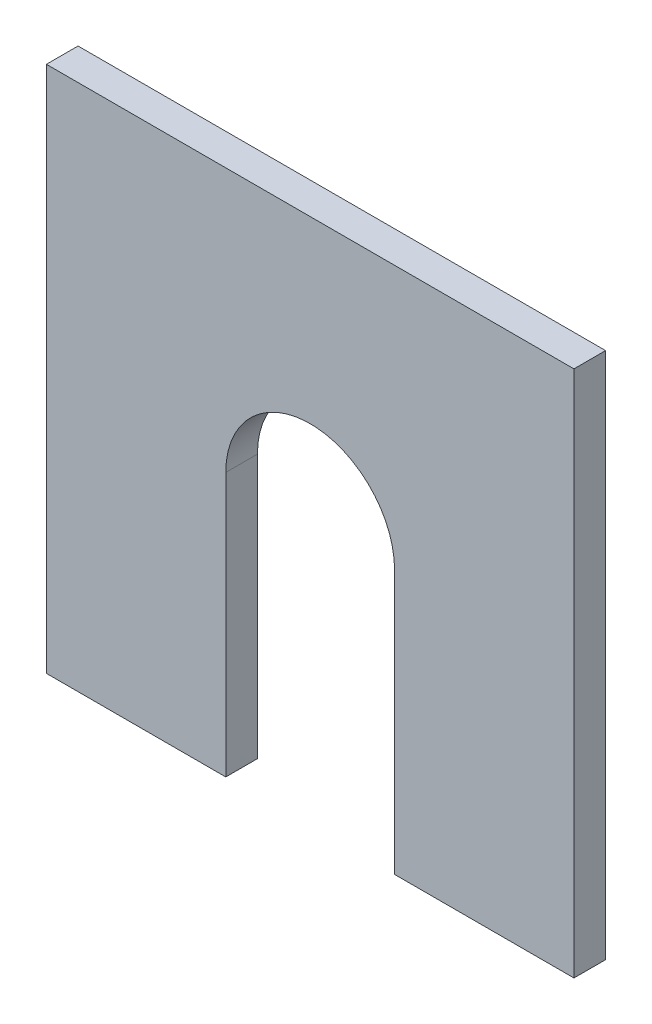
ISO-10303-21;
HEADER;
FILE_DESCRIPTION(('STEP AP214'),'2;1');
FILE_NAME('part.step','',(''),(''),'','','');
FILE_SCHEMA(('AUTOMOTIVE_DESIGN { 1 0 10303 214 1 1 1 1 }'));
ENDSEC;
DATA;
#1=APPLICATION_CONTEXT('core data for automotive mechanical design processes');
#2=APPLICATION_PROTOCOL_DEFINITION('international standard','automotive_design',2000,#1);
#3=PRODUCT_CONTEXT('',#1,'mechanical');
#4=PRODUCT('Part','Part','',(#3));
#5=PRODUCT_RELATED_PRODUCT_CATEGORY('part','',(#4));
#6=PRODUCT_DEFINITION_FORMATION('','',#4);
#7=PRODUCT_DEFINITION_CONTEXT('part definition',#1,'design');
#8=PRODUCT_DEFINITION('design','',#6,#7);
#9=PRODUCT_DEFINITION_SHAPE('','',#8);
#10=(LENGTH_UNIT() NAMED_UNIT(*) SI_UNIT(.MILLI.,.METRE.));
#11=(NAMED_UNIT(*) PLANE_ANGLE_UNIT() SI_UNIT($,.RADIAN.));
#12=(NAMED_UNIT(*) SI_UNIT($,.STERADIAN.) SOLID_ANGLE_UNIT());
#13=UNCERTAINTY_MEASURE_WITH_UNIT(LENGTH_MEASURE(1.E-05),#10,'distance_accuracy_value','');
#14=(GEOMETRIC_REPRESENTATION_CONTEXT(3) GLOBAL_UNCERTAINTY_ASSIGNED_CONTEXT((#13)) GLOBAL_UNIT_ASSIGNED_CONTEXT((#10,
#11,#12)) REPRESENTATION_CONTEXT('',''));
#15=CARTESIAN_POINT('',(0.,0.,0.));
#16=DIRECTION('',(0.,0.,1.));
#17=DIRECTION('',(1.,0.,0.));
#18=AXIS2_PLACEMENT_3D('',#15,#16,#17);
#19=CARTESIAN_POINT('',(-12.5,-12.5,1.5));
#20=DIRECTION('',(0.,1.,0.));
#21=DIRECTION('',(0.,0.,1.));
#22=AXIS2_PLACEMENT_3D('',#19,#20,#21);
#23=PLANE('',#22);
#24=DIRECTION('',(1.,0.,0.));
#25=VECTOR('',#24,1.);
#26=CARTESIAN_POINT('',(-12.5,-12.5,1.5));
#27=LINE('',#26,#25);
#28=CARTESIAN_POINT('',(4.,-12.5,1.5));
#29=VERTEX_POINT('',#28);
#30=CARTESIAN_POINT('',(12.5,-12.5,1.5));
#31=VERTEX_POINT('',#30);
#32=EDGE_CURVE('E70',#29,#31,#27,.T.);
#33=ORIENTED_EDGE('',*,*,#32,.F.);
#34=DIRECTION('',(0.,0.,1.));
#35=VECTOR('',#34,1.);
#36=CARTESIAN_POINT('',(4.,-12.5,0.));
#37=LINE('',#36,#35);
#38=CARTESIAN_POINT('',(4.,-12.5,0.));
#39=VERTEX_POINT('',#38);
#40=EDGE_CURVE('E159',#39,#29,#37,.T.);
#41=ORIENTED_EDGE('',*,*,#40,.F.);
#42=DIRECTION('',(1.,0.,0.));
#43=VECTOR('',#42,1.);
#44=CARTESIAN_POINT('',(-12.5,-12.5,0.));
#45=LINE('',#44,#43);
#46=CARTESIAN_POINT('',(12.5,-12.5,0.));
#47=VERTEX_POINT('',#46);
#48=EDGE_CURVE('E92',#39,#47,#45,.T.);
#49=ORIENTED_EDGE('',*,*,#48,.T.);
#50=DIRECTION('',(0.,0.,-1.));
#51=VECTOR('',#50,1.);
#52=CARTESIAN_POINT('',(12.5,-12.5,1.5));
#53=LINE('',#52,#51);
#54=EDGE_CURVE('E177',#31,#47,#53,.T.);
#55=ORIENTED_EDGE('',*,*,#54,.F.);
#56=EDGE_LOOP('',(#33,#41,#49,#55));
#57=FACE_BOUND('',#56,.T.);
#58=ADVANCED_FACE('F45',(#57),#23,.F.);
#59=CARTESIAN_POINT('',(12.5,-12.5,1.5));
#60=DIRECTION('',(-1.,0.,0.));
#61=DIRECTION('',(0.,0.,1.));
#62=AXIS2_PLACEMENT_3D('',#59,#60,#61);
#63=PLANE('',#62);
#64=DIRECTION('',(0.,1.,0.));
#65=VECTOR('',#64,1.);
#66=CARTESIAN_POINT('',(12.5,-12.5,0.));
#67=LINE('',#66,#65);
#68=CARTESIAN_POINT('',(12.5,12.5,0.));
#69=VERTEX_POINT('',#68);
#70=EDGE_CURVE('E158',#47,#69,#67,.T.);
#71=ORIENTED_EDGE('',*,*,#70,.T.);
#72=DIRECTION('',(0.,0.,-1.));
#73=VECTOR('',#72,1.);
#74=CARTESIAN_POINT('',(12.5,12.5,1.5));
#75=LINE('',#74,#73);
#76=CARTESIAN_POINT('',(12.5,12.5,1.5));
#77=VERTEX_POINT('',#76);
#78=EDGE_CURVE('E11',#77,#69,#75,.T.);
#79=ORIENTED_EDGE('',*,*,#78,.F.);
#80=DIRECTION('',(0.,1.,0.));
#81=VECTOR('',#80,1.);
#82=CARTESIAN_POINT('',(12.5,-12.5,1.5));
#83=LINE('',#82,#81);
#84=EDGE_CURVE('E164',#31,#77,#83,.T.);
#85=ORIENTED_EDGE('',*,*,#84,.F.);
#86=ORIENTED_EDGE('',*,*,#54,.T.);
#87=EDGE_LOOP('',(#71,#79,#85,#86));
#88=FACE_BOUND('',#87,.T.);
#89=ADVANCED_FACE('F47',(#88),#63,.F.);
#90=CARTESIAN_POINT('',(-12.5,12.5,1.5));
#91=DIRECTION('',(0.,-1.,0.));
#92=DIRECTION('',(0.,0.,-1.));
#93=AXIS2_PLACEMENT_3D('',#90,#91,#92);
#94=PLANE('',#93);
#95=DIRECTION('',(-1.,0.,0.));
#96=VECTOR('',#95,1.);
#97=CARTESIAN_POINT('',(-12.5,12.5,0.));
#98=LINE('',#97,#96);
#99=CARTESIAN_POINT('',(-12.5,12.5,0.));
#100=VERTEX_POINT('',#99);
#101=EDGE_CURVE('E181',#69,#100,#98,.T.);
#102=ORIENTED_EDGE('',*,*,#101,.T.);
#103=DIRECTION('',(0.,0.,-1.));
#104=VECTOR('',#103,1.);
#105=CARTESIAN_POINT('',(-12.5,12.5,1.5));
#106=LINE('',#105,#104);
#107=CARTESIAN_POINT('',(-12.5,12.5,1.5));
#108=VERTEX_POINT('',#107);
#109=EDGE_CURVE('E54',#108,#100,#106,.T.);
#110=ORIENTED_EDGE('',*,*,#109,.F.);
#111=DIRECTION('',(-1.,0.,0.));
#112=VECTOR('',#111,1.);
#113=CARTESIAN_POINT('',(-12.5,12.5,1.5));
#114=LINE('',#113,#112);
#115=EDGE_CURVE('E99',#77,#108,#114,.T.);
#116=ORIENTED_EDGE('',*,*,#115,.F.);
#117=ORIENTED_EDGE('',*,*,#78,.T.);
#118=EDGE_LOOP('',(#102,#110,#116,#117));
#119=FACE_BOUND('',#118,.T.);
#120=ADVANCED_FACE('F209',(#119),#94,.F.);
#121=CARTESIAN_POINT('',(-12.5,-12.5,1.5));
#122=DIRECTION('',(1.,0.,0.));
#123=DIRECTION('',(0.,0.,-1.));
#124=AXIS2_PLACEMENT_3D('',#121,#122,#123);
#125=PLANE('',#124);
#126=DIRECTION('',(0.,-1.,0.));
#127=VECTOR('',#126,1.);
#128=CARTESIAN_POINT('',(-12.5,-12.5,0.));
#129=LINE('',#128,#127);
#130=CARTESIAN_POINT('',(-12.5,-12.5,0.));
#131=VERTEX_POINT('',#130);
#132=EDGE_CURVE('E184',#100,#131,#129,.T.);
#133=ORIENTED_EDGE('',*,*,#132,.T.);
#134=DIRECTION('',(0.,0.,-1.));
#135=VECTOR('',#134,1.);
#136=CARTESIAN_POINT('',(-12.5,-12.5,1.5));
#137=LINE('',#136,#135);
#138=CARTESIAN_POINT('',(-12.5,-12.5,1.5));
#139=VERTEX_POINT('',#138);
#140=EDGE_CURVE('E191',#139,#131,#137,.T.);
#141=ORIENTED_EDGE('',*,*,#140,.F.);
#142=DIRECTION('',(0.,-1.,0.));
#143=VECTOR('',#142,1.);
#144=CARTESIAN_POINT('',(-12.5,-12.5,1.5));
#145=LINE('',#144,#143);
#146=EDGE_CURVE('E170',#108,#139,#145,.T.);
#147=ORIENTED_EDGE('',*,*,#146,.F.);
#148=ORIENTED_EDGE('',*,*,#109,.T.);
#149=EDGE_LOOP('',(#133,#141,#147,#148));
#150=FACE_BOUND('',#149,.T.);
#151=ADVANCED_FACE('F199',(#150),#125,.F.);
#152=CARTESIAN_POINT('',(-4.,-12.5,0.));
#153=VERTEX_POINT('',#152);
#154=EDGE_CURVE('E167',#131,#153,#45,.T.);
#155=ORIENTED_EDGE('',*,*,#154,.T.);
#156=DIRECTION('',(0.,0.,1.));
#157=VECTOR('',#156,1.);
#158=CARTESIAN_POINT('',(-4.,-12.5,0.));
#159=LINE('',#158,#157);
#160=CARTESIAN_POINT('',(-4.,-12.5,1.5));
#161=VERTEX_POINT('',#160);
#162=EDGE_CURVE('E61',#153,#161,#159,.T.);
#163=ORIENTED_EDGE('',*,*,#162,.T.);
#164=EDGE_CURVE('E173',#139,#161,#27,.T.);
#165=ORIENTED_EDGE('',*,*,#164,.F.);
#166=ORIENTED_EDGE('',*,*,#140,.T.);
#167=EDGE_LOOP('',(#155,#163,#165,#166));
#168=FACE_BOUND('',#167,.T.);
#169=ADVANCED_FACE('F203',(#168),#23,.F.);
#170=CARTESIAN_POINT('',(0.,0.,1.5));
#171=DIRECTION('',(0.,0.,-1.));
#172=DIRECTION('',(-1.,0.,0.));
#173=AXIS2_PLACEMENT_3D('',#170,#171,#172);
#174=PLANE('',#173);
#175=CARTESIAN_POINT('',(0.,0.,1.5));
#176=DIRECTION('',(0.,0.,1.));
#177=DIRECTION('',(-1.,0.,0.));
#178=AXIS2_PLACEMENT_3D('',#175,#176,#177);
#179=CIRCLE('',#178,4.);
#180=CARTESIAN_POINT('',(4.,0.,1.5));
#181=VERTEX_POINT('',#180);
#182=CARTESIAN_POINT('',(-4.,0.,1.5));
#183=VERTEX_POINT('',#182);
#184=EDGE_CURVE('E128',#181,#183,#179,.T.);
#185=ORIENTED_EDGE('',*,*,#184,.F.);
#186=DIRECTION('',(0.,1.,0.));
#187=VECTOR('',#186,1.);
#188=CARTESIAN_POINT('',(4.,0.,1.5));
#189=LINE('',#188,#187);
#190=EDGE_CURVE('E142',#29,#181,#189,.T.);
#191=ORIENTED_EDGE('',*,*,#190,.F.);
#192=ORIENTED_EDGE('',*,*,#32,.T.);
#193=ORIENTED_EDGE('',*,*,#84,.T.);
#194=ORIENTED_EDGE('',*,*,#115,.T.);
#195=ORIENTED_EDGE('',*,*,#146,.T.);
#196=ORIENTED_EDGE('',*,*,#164,.T.);
#197=DIRECTION('',(0.,-1.,0.));
#198=VECTOR('',#197,1.);
#199=CARTESIAN_POINT('',(-4.,0.,1.5));
#200=LINE('',#199,#198);
#201=EDGE_CURVE('E146',#183,#161,#200,.T.);
#202=ORIENTED_EDGE('',*,*,#201,.F.);
#203=EDGE_LOOP('',(#185,#191,#192,#193,#194,#195,#196,#202));
#204=FACE_BOUND('',#203,.T.);
#205=ADVANCED_FACE('F205',(#204),#174,.F.);
#206=CARTESIAN_POINT('',(0.,0.,0.));
#207=DIRECTION('',(0.,0.,-1.));
#208=DIRECTION('',(-1.,0.,0.));
#209=AXIS2_PLACEMENT_3D('',#206,#207,#208);
#210=PLANE('',#209);
#211=DIRECTION('',(0.,1.,0.));
#212=VECTOR('',#211,1.);
#213=CARTESIAN_POINT('',(4.,0.,0.));
#214=LINE('',#213,#212);
#215=CARTESIAN_POINT('',(4.,0.,0.));
#216=VERTEX_POINT('',#215);
#217=EDGE_CURVE('E131',#39,#216,#214,.T.);
#218=ORIENTED_EDGE('',*,*,#217,.T.);
#219=CARTESIAN_POINT('',(0.,0.,0.));
#220=DIRECTION('',(0.,0.,1.));
#221=DIRECTION('',(-1.,0.,0.));
#222=AXIS2_PLACEMENT_3D('',#219,#220,#221);
#223=CIRCLE('',#222,4.);
#224=CARTESIAN_POINT('',(-4.,0.,0.));
#225=VERTEX_POINT('',#224);
#226=EDGE_CURVE('E125',#216,#225,#223,.T.);
#227=ORIENTED_EDGE('',*,*,#226,.T.);
#228=DIRECTION('',(0.,-1.,0.));
#229=VECTOR('',#228,1.);
#230=CARTESIAN_POINT('',(-4.,0.,0.));
#231=LINE('',#230,#229);
#232=EDGE_CURVE('E133',#225,#153,#231,.T.);
#233=ORIENTED_EDGE('',*,*,#232,.T.);
#234=ORIENTED_EDGE('',*,*,#154,.F.);
#235=ORIENTED_EDGE('',*,*,#132,.F.);
#236=ORIENTED_EDGE('',*,*,#101,.F.);
#237=ORIENTED_EDGE('',*,*,#70,.F.);
#238=ORIENTED_EDGE('',*,*,#48,.F.);
#239=EDGE_LOOP('',(#218,#227,#233,#234,#235,#236,#237,#238));
#240=FACE_BOUND('',#239,.T.);
#241=ADVANCED_FACE('F140',(#240),#210,.T.);
#242=CARTESIAN_POINT('',(0.,0.,0.));
#243=DIRECTION('',(0.,0.,1.));
#244=DIRECTION('',(1.,0.,0.));
#245=AXIS2_PLACEMENT_3D('',#242,#243,#244);
#246=CYLINDRICAL_SURFACE('',#245,4.);
#247=ORIENTED_EDGE('',*,*,#184,.T.);
#248=DIRECTION('',(0.,0.,1.));
#249=VECTOR('',#248,1.);
#250=CARTESIAN_POINT('',(-4.,0.,0.));
#251=LINE('',#250,#249);
#252=EDGE_CURVE('E122',#225,#183,#251,.T.);
#253=ORIENTED_EDGE('',*,*,#252,.F.);
#254=ORIENTED_EDGE('',*,*,#226,.F.);
#255=DIRECTION('',(0.,0.,1.));
#256=VECTOR('',#255,1.);
#257=CARTESIAN_POINT('',(4.,0.,0.));
#258=LINE('',#257,#256);
#259=EDGE_CURVE('E155',#216,#181,#258,.T.);
#260=ORIENTED_EDGE('',*,*,#259,.T.);
#261=EDGE_LOOP('',(#247,#253,#254,#260));
#262=FACE_BOUND('',#261,.T.);
#263=ADVANCED_FACE('F123',(#262),#246,.F.);
#264=CARTESIAN_POINT('',(4.,0.,0.));
#265=DIRECTION('',(1.,0.,0.));
#266=DIRECTION('',(0.,1.,0.));
#267=AXIS2_PLACEMENT_3D('',#264,#265,#266);
#268=PLANE('',#267);
#269=ORIENTED_EDGE('',*,*,#190,.T.);
#270=ORIENTED_EDGE('',*,*,#259,.F.);
#271=ORIENTED_EDGE('',*,*,#217,.F.);
#272=ORIENTED_EDGE('',*,*,#40,.T.);
#273=EDGE_LOOP('',(#269,#270,#271,#272));
#274=FACE_BOUND('',#273,.T.);
#275=ADVANCED_FACE('F232',(#274),#268,.F.);
#276=CARTESIAN_POINT('',(-4.,0.,0.));
#277=DIRECTION('',(-1.,0.,0.));
#278=DIRECTION('',(0.,0.,1.));
#279=AXIS2_PLACEMENT_3D('',#276,#277,#278);
#280=PLANE('',#279);
#281=ORIENTED_EDGE('',*,*,#201,.T.);
#282=ORIENTED_EDGE('',*,*,#162,.F.);
#283=ORIENTED_EDGE('',*,*,#232,.F.);
#284=ORIENTED_EDGE('',*,*,#252,.T.);
#285=EDGE_LOOP('',(#281,#282,#283,#284));
#286=FACE_BOUND('',#285,.T.);
#287=ADVANCED_FACE('F134',(#286),#280,.F.);
#288=CLOSED_SHELL('',(#58,#89,#120,#151,#169,#205,#241,#263,#275,#287));
#289=MANIFOLD_SOLID_BREP('B2',#288);
#290=ADVANCED_BREP_SHAPE_REPRESENTATION('',(#18,#289),#14);
#291=SHAPE_DEFINITION_REPRESENTATION(#9,#290);
ENDSEC;
END-ISO-10303-21;
